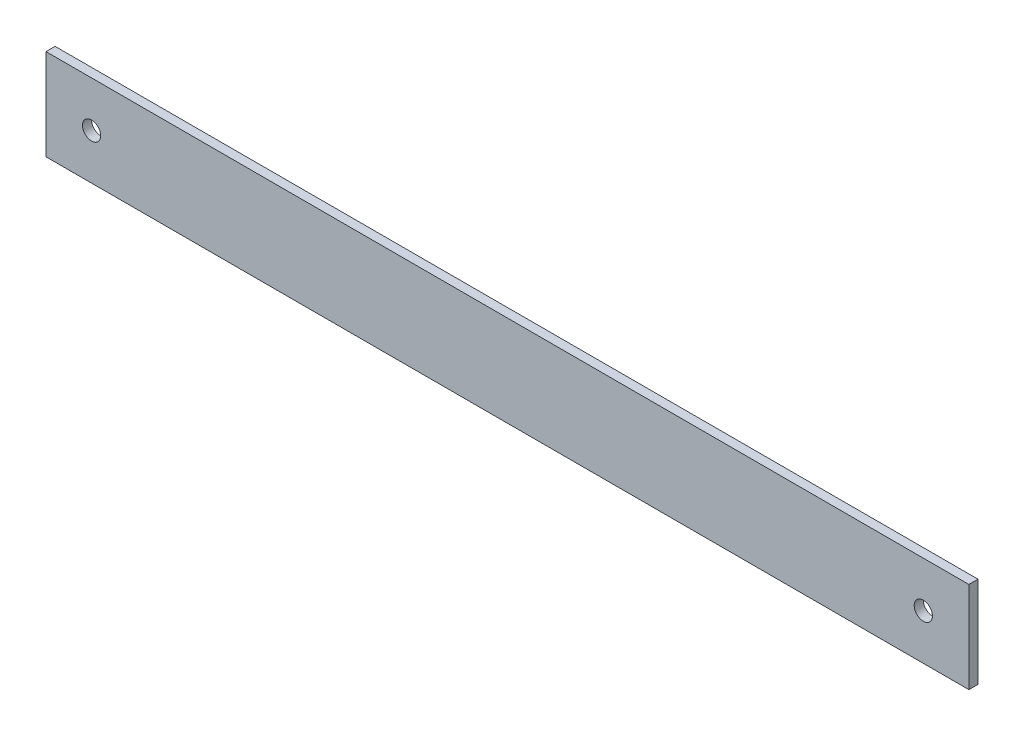
ISO-10303-21;
HEADER;
FILE_DESCRIPTION(('STEP AP214'),'2;1');
FILE_NAME('part.step','',(''),(''),'','','');
FILE_SCHEMA(('AUTOMOTIVE_DESIGN { 1 0 10303 214 1 1 1 1 }'));
ENDSEC;
DATA;
#1=APPLICATION_CONTEXT('core data for automotive mechanical design processes');
#2=APPLICATION_PROTOCOL_DEFINITION('international standard','automotive_design',2000,#1);
#3=PRODUCT_CONTEXT('',#1,'mechanical');
#4=PRODUCT('Part','Part','',(#3));
#5=PRODUCT_RELATED_PRODUCT_CATEGORY('part','',(#4));
#6=PRODUCT_DEFINITION_FORMATION('','',#4);
#7=PRODUCT_DEFINITION_CONTEXT('part definition',#1,'design');
#8=PRODUCT_DEFINITION('design','',#6,#7);
#9=PRODUCT_DEFINITION_SHAPE('','',#8);
#10=(LENGTH_UNIT() NAMED_UNIT(*) SI_UNIT(.MILLI.,.METRE.));
#11=(NAMED_UNIT(*) PLANE_ANGLE_UNIT() SI_UNIT($,.RADIAN.));
#12=(NAMED_UNIT(*) SI_UNIT($,.STERADIAN.) SOLID_ANGLE_UNIT());
#13=UNCERTAINTY_MEASURE_WITH_UNIT(LENGTH_MEASURE(1.E-05),#10,'distance_accuracy_value','');
#14=(GEOMETRIC_REPRESENTATION_CONTEXT(3) GLOBAL_UNCERTAINTY_ASSIGNED_CONTEXT((#13)) GLOBAL_UNIT_ASSIGNED_CONTEXT((#10,
#11,#12)) REPRESENTATION_CONTEXT('',''));
#15=CARTESIAN_POINT('',(0.,0.,0.));
#16=DIRECTION('',(0.,0.,1.));
#17=DIRECTION('',(1.,0.,0.));
#18=AXIS2_PLACEMENT_3D('',#15,#16,#17);
#19=CARTESIAN_POINT('',(101.275,10.,2.));
#20=DIRECTION('',(-1.,0.,0.));
#21=DIRECTION('',(0.,-1.,0.));
#22=AXIS2_PLACEMENT_3D('',#19,#20,#21);
#23=PLANE('',#22);
#24=DIRECTION('',(0.,1.,0.));
#25=VECTOR('',#24,1.);
#26=CARTESIAN_POINT('',(101.275,10.,0.));
#27=LINE('',#26,#25);
#28=CARTESIAN_POINT('',(101.275,-9.99999999999999,0.));
#29=VERTEX_POINT('',#28);
#30=CARTESIAN_POINT('',(101.275,10.,0.));
#31=VERTEX_POINT('',#30);
#32=EDGE_CURVE('E100',#29,#31,#27,.T.);
#33=ORIENTED_EDGE('',*,*,#32,.T.);
#34=DIRECTION('',(0.,0.,-1.));
#35=VECTOR('',#34,1.);
#36=CARTESIAN_POINT('',(101.275,10.,2.));
#37=LINE('',#36,#35);
#38=CARTESIAN_POINT('',(101.275,10.,2.));
#39=VERTEX_POINT('',#38);
#40=EDGE_CURVE('E11',#39,#31,#37,.T.);
#41=ORIENTED_EDGE('',*,*,#40,.F.);
#42=DIRECTION('',(0.,1.,0.));
#43=VECTOR('',#42,1.);
#44=CARTESIAN_POINT('',(101.275,10.,2.));
#45=LINE('',#44,#43);
#46=CARTESIAN_POINT('',(101.275,-9.99999999999999,2.));
#47=VERTEX_POINT('',#46);
#48=EDGE_CURVE('E88',#47,#39,#45,.T.);
#49=ORIENTED_EDGE('',*,*,#48,.F.);
#50=DIRECTION('',(0.,0.,-1.));
#51=VECTOR('',#50,1.);
#52=CARTESIAN_POINT('',(101.275,-9.99999999999999,2.));
#53=LINE('',#52,#51);
#54=EDGE_CURVE('E96',#47,#29,#53,.T.);
#55=ORIENTED_EDGE('',*,*,#54,.T.);
#56=EDGE_LOOP('',(#33,#41,#49,#55));
#57=FACE_BOUND('',#56,.T.);
#58=ADVANCED_FACE('F37',(#57),#23,.F.);
#59=CARTESIAN_POINT('',(-101.275,10.,2.));
#60=DIRECTION('',(0.,-1.,0.));
#61=DIRECTION('',(0.,0.,-1.));
#62=AXIS2_PLACEMENT_3D('',#59,#60,#61);
#63=PLANE('',#62);
#64=DIRECTION('',(-1.,0.,0.));
#65=VECTOR('',#64,1.);
#66=CARTESIAN_POINT('',(-101.275,10.,0.));
#67=LINE('',#66,#65);
#68=CARTESIAN_POINT('',(-101.275,10.,0.));
#69=VERTEX_POINT('',#68);
#70=EDGE_CURVE('E92',#31,#69,#67,.T.);
#71=ORIENTED_EDGE('',*,*,#70,.T.);
#72=DIRECTION('',(0.,0.,-1.));
#73=VECTOR('',#72,1.);
#74=CARTESIAN_POINT('',(-101.275,10.,2.));
#75=LINE('',#74,#73);
#76=CARTESIAN_POINT('',(-101.275,10.,2.));
#77=VERTEX_POINT('',#76);
#78=EDGE_CURVE('E45',#77,#69,#75,.T.);
#79=ORIENTED_EDGE('',*,*,#78,.F.);
#80=DIRECTION('',(-1.,0.,0.));
#81=VECTOR('',#80,1.);
#82=CARTESIAN_POINT('',(-101.275,10.,2.));
#83=LINE('',#82,#81);
#84=EDGE_CURVE('E83',#39,#77,#83,.T.);
#85=ORIENTED_EDGE('',*,*,#84,.F.);
#86=ORIENTED_EDGE('',*,*,#40,.T.);
#87=EDGE_LOOP('',(#71,#79,#85,#86));
#88=FACE_BOUND('',#87,.T.);
#89=ADVANCED_FACE('F91',(#88),#63,.F.);
#90=CARTESIAN_POINT('',(-101.275,10.,2.));
#91=DIRECTION('',(1.,0.,0.));
#92=DIRECTION('',(0.,1.,0.));
#93=AXIS2_PLACEMENT_3D('',#90,#91,#92);
#94=PLANE('',#93);
#95=DIRECTION('',(0.,-1.,0.));
#96=VECTOR('',#95,1.);
#97=CARTESIAN_POINT('',(-101.275,10.,0.));
#98=LINE('',#97,#96);
#99=CARTESIAN_POINT('',(-101.275,-9.99999999999999,0.));
#100=VERTEX_POINT('',#99);
#101=EDGE_CURVE('E70',#69,#100,#98,.T.);
#102=ORIENTED_EDGE('',*,*,#101,.T.);
#103=DIRECTION('',(0.,0.,-1.));
#104=VECTOR('',#103,1.);
#105=CARTESIAN_POINT('',(-101.275,-9.99999999999999,2.));
#106=LINE('',#105,#104);
#107=CARTESIAN_POINT('',(-101.275,-9.99999999999999,2.));
#108=VERTEX_POINT('',#107);
#109=EDGE_CURVE('E93',#108,#100,#106,.T.);
#110=ORIENTED_EDGE('',*,*,#109,.F.);
#111=DIRECTION('',(0.,-1.,0.));
#112=VECTOR('',#111,1.);
#113=CARTESIAN_POINT('',(-101.275,10.,2.));
#114=LINE('',#113,#112);
#115=EDGE_CURVE('E86',#77,#108,#114,.T.);
#116=ORIENTED_EDGE('',*,*,#115,.F.);
#117=ORIENTED_EDGE('',*,*,#78,.T.);
#118=EDGE_LOOP('',(#102,#110,#116,#117));
#119=FACE_BOUND('',#118,.T.);
#120=ADVANCED_FACE('F94',(#119),#94,.F.);
#121=CARTESIAN_POINT('',(-101.275,-9.99999999999999,2.));
#122=DIRECTION('',(0.,1.,0.));
#123=DIRECTION('',(0.,0.,1.));
#124=AXIS2_PLACEMENT_3D('',#121,#122,#123);
#125=PLANE('',#124);
#126=DIRECTION('',(1.,0.,0.));
#127=VECTOR('',#126,1.);
#128=CARTESIAN_POINT('',(-101.275,-9.99999999999999,0.));
#129=LINE('',#128,#127);
#130=EDGE_CURVE('E76',#100,#29,#129,.T.);
#131=ORIENTED_EDGE('',*,*,#130,.T.);
#132=ORIENTED_EDGE('',*,*,#54,.F.);
#133=DIRECTION('',(1.,0.,0.));
#134=VECTOR('',#133,1.);
#135=CARTESIAN_POINT('',(-101.275,-9.99999999999999,2.));
#136=LINE('',#135,#134);
#137=EDGE_CURVE('E53',#108,#47,#136,.T.);
#138=ORIENTED_EDGE('',*,*,#137,.F.);
#139=ORIENTED_EDGE('',*,*,#109,.T.);
#140=EDGE_LOOP('',(#131,#132,#138,#139));
#141=FACE_BOUND('',#140,.T.);
#142=ADVANCED_FACE('F108',(#141),#125,.F.);
#143=CARTESIAN_POINT('',(0.,0.,2.));
#144=DIRECTION('',(0.,0.,1.));
#145=DIRECTION('',(1.,0.,0.));
#146=AXIS2_PLACEMENT_3D('',#143,#144,#145);
#147=PLANE('',#146);
#148=CARTESIAN_POINT('',(-91.2750000000001,0.,2.));
#149=DIRECTION('',(0.,0.,1.));
#150=DIRECTION('',(1.,0.,0.));
#151=AXIS2_PLACEMENT_3D('',#148,#149,#150);
#152=CIRCLE('',#151,2.);
#153=CARTESIAN_POINT('',(-89.2750000000001,0.,2.));
#154=VERTEX_POINT('',#153);
#155=EDGE_CURVE('E120',#154,#154,#152,.T.);
#156=ORIENTED_EDGE('',*,*,#155,.F.);
#157=EDGE_LOOP('',(#156));
#158=FACE_BOUND('',#157,.T.);
#159=CARTESIAN_POINT('',(91.275,0.,2.));
#160=DIRECTION('',(0.,0.,1.));
#161=DIRECTION('',(1.,0.,0.));
#162=AXIS2_PLACEMENT_3D('',#159,#160,#161);
#163=CIRCLE('',#162,2.);
#164=CARTESIAN_POINT('',(93.275,0.,2.));
#165=VERTEX_POINT('',#164);
#166=EDGE_CURVE('E114',#165,#165,#163,.T.);
#167=ORIENTED_EDGE('',*,*,#166,.F.);
#168=EDGE_LOOP('',(#167));
#169=FACE_BOUND('',#168,.T.);
#170=ORIENTED_EDGE('',*,*,#48,.T.);
#171=ORIENTED_EDGE('',*,*,#84,.T.);
#172=ORIENTED_EDGE('',*,*,#115,.T.);
#173=ORIENTED_EDGE('',*,*,#137,.T.);
#174=EDGE_LOOP('',(#170,#171,#172,#173));
#175=FACE_BOUND('',#174,.T.);
#176=ADVANCED_FACE('F84',(#158,#169,#175),#147,.T.);
#177=CARTESIAN_POINT('',(0.,0.,0.));
#178=DIRECTION('',(0.,0.,1.));
#179=DIRECTION('',(1.,0.,0.));
#180=AXIS2_PLACEMENT_3D('',#177,#178,#179);
#181=PLANE('',#180);
#182=CARTESIAN_POINT('',(-91.2750000000001,0.,0.));
#183=DIRECTION('',(0.,0.,1.));
#184=DIRECTION('',(1.,0.,0.));
#185=AXIS2_PLACEMENT_3D('',#182,#183,#184);
#186=CIRCLE('',#185,2.);
#187=CARTESIAN_POINT('',(-89.2750000000001,0.,0.));
#188=VERTEX_POINT('',#187);
#189=EDGE_CURVE('E103',#188,#188,#186,.T.);
#190=ORIENTED_EDGE('',*,*,#189,.T.);
#191=EDGE_LOOP('',(#190));
#192=FACE_BOUND('',#191,.T.);
#193=CARTESIAN_POINT('',(91.275,0.,0.));
#194=DIRECTION('',(0.,0.,1.));
#195=DIRECTION('',(1.,0.,0.));
#196=AXIS2_PLACEMENT_3D('',#193,#194,#195);
#197=CIRCLE('',#196,2.);
#198=CARTESIAN_POINT('',(93.275,0.,0.));
#199=VERTEX_POINT('',#198);
#200=EDGE_CURVE('E117',#199,#199,#197,.T.);
#201=ORIENTED_EDGE('',*,*,#200,.T.);
#202=EDGE_LOOP('',(#201));
#203=FACE_BOUND('',#202,.T.);
#204=ORIENTED_EDGE('',*,*,#32,.F.);
#205=ORIENTED_EDGE('',*,*,#130,.F.);
#206=ORIENTED_EDGE('',*,*,#101,.F.);
#207=ORIENTED_EDGE('',*,*,#70,.F.);
#208=EDGE_LOOP('',(#204,#205,#206,#207));
#209=FACE_BOUND('',#208,.T.);
#210=ADVANCED_FACE('F111',(#192,#203,#209),#181,.F.);
#211=CARTESIAN_POINT('',(91.275,0.,0.));
#212=DIRECTION('',(0.,0.,1.));
#213=DIRECTION('',(1.,0.,0.));
#214=AXIS2_PLACEMENT_3D('',#211,#212,#213);
#215=CYLINDRICAL_SURFACE('',#214,2.);
#216=ORIENTED_EDGE('',*,*,#200,.F.);
#217=EDGE_LOOP('',(#216));
#218=FACE_BOUND('',#217,.T.);
#219=ORIENTED_EDGE('',*,*,#166,.T.);
#220=EDGE_LOOP('',(#219));
#221=FACE_BOUND('',#220,.T.);
#222=ADVANCED_FACE('F131',(#218,#221),#215,.F.);
#223=CARTESIAN_POINT('',(-91.2750000000001,0.,0.));
#224=DIRECTION('',(0.,0.,1.));
#225=DIRECTION('',(1.,0.,0.));
#226=AXIS2_PLACEMENT_3D('',#223,#224,#225);
#227=CYLINDRICAL_SURFACE('',#226,2.);
#228=ORIENTED_EDGE('',*,*,#189,.F.);
#229=EDGE_LOOP('',(#228));
#230=FACE_BOUND('',#229,.T.);
#231=ORIENTED_EDGE('',*,*,#155,.T.);
#232=EDGE_LOOP('',(#231));
#233=FACE_BOUND('',#232,.T.);
#234=ADVANCED_FACE('F128',(#230,#233),#227,.F.);
#235=CLOSED_SHELL('',(#58,#89,#120,#142,#176,#210,#222,#234));
#236=MANIFOLD_SOLID_BREP('B2',#235);
#237=ADVANCED_BREP_SHAPE_REPRESENTATION('',(#18,#236),#14);
#238=SHAPE_DEFINITION_REPRESENTATION(#9,#237);
ENDSEC;
END-ISO-10303-21;
